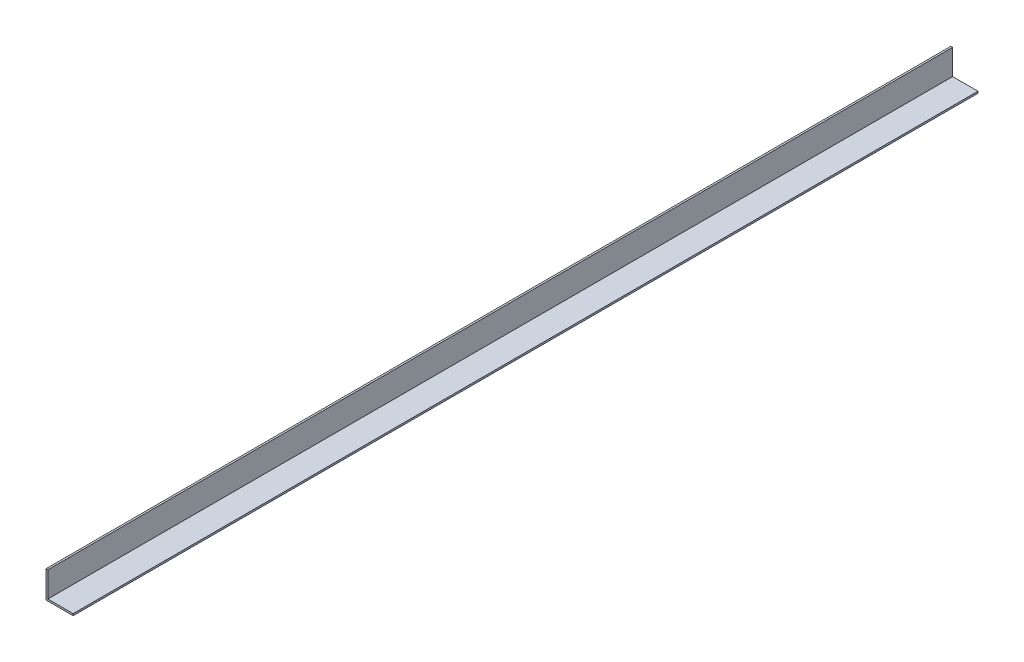
ISO-10303-21;
HEADER;
FILE_DESCRIPTION(('STEP AP214'),'2;1');
FILE_NAME('part.step','',(''),(''),'','','');
FILE_SCHEMA(('AUTOMOTIVE_DESIGN { 1 0 10303 214 1 1 1 1 }'));
ENDSEC;
DATA;
#1=APPLICATION_CONTEXT('core data for automotive mechanical design processes');
#2=APPLICATION_PROTOCOL_DEFINITION('international standard','automotive_design',2000,#1);
#3=PRODUCT_CONTEXT('',#1,'mechanical');
#4=PRODUCT('Part','Part','',(#3));
#5=PRODUCT_RELATED_PRODUCT_CATEGORY('part','',(#4));
#6=PRODUCT_DEFINITION_FORMATION('','',#4);
#7=PRODUCT_DEFINITION_CONTEXT('part definition',#1,'design');
#8=PRODUCT_DEFINITION('design','',#6,#7);
#9=PRODUCT_DEFINITION_SHAPE('','',#8);
#10=(LENGTH_UNIT() NAMED_UNIT(*) SI_UNIT(.MILLI.,.METRE.));
#11=(NAMED_UNIT(*) PLANE_ANGLE_UNIT() SI_UNIT($,.RADIAN.));
#12=(NAMED_UNIT(*) SI_UNIT($,.STERADIAN.) SOLID_ANGLE_UNIT());
#13=UNCERTAINTY_MEASURE_WITH_UNIT(LENGTH_MEASURE(1.E-05),#10,'distance_accuracy_value','');
#14=(GEOMETRIC_REPRESENTATION_CONTEXT(3) GLOBAL_UNCERTAINTY_ASSIGNED_CONTEXT((#13)) GLOBAL_UNIT_ASSIGNED_CONTEXT((#10,
#11,#12)) REPRESENTATION_CONTEXT('',''));
#15=CARTESIAN_POINT('',(0.,0.,0.));
#16=DIRECTION('',(0.,0.,1.));
#17=DIRECTION('',(1.,0.,0.));
#18=AXIS2_PLACEMENT_3D('',#15,#16,#17);
#19=CARTESIAN_POINT('',(-30.,0.,1000.));
#20=DIRECTION('',(1.,0.,0.));
#21=DIRECTION('',(0.,0.,-1.));
#22=AXIS2_PLACEMENT_3D('',#19,#20,#21);
#23=PLANE('',#22);
#24=DIRECTION('',(0.,-1.,0.));
#25=VECTOR('',#24,1.);
#26=CARTESIAN_POINT('',(-30.,0.,0.));
#27=LINE('',#26,#25);
#28=CARTESIAN_POINT('',(-30.,30.,0.));
#29=VERTEX_POINT('',#28);
#30=CARTESIAN_POINT('',(-30.,0.,0.));
#31=VERTEX_POINT('',#30);
#32=EDGE_CURVE('E117',#29,#31,#27,.T.);
#33=ORIENTED_EDGE('',*,*,#32,.T.);
#34=DIRECTION('',(0.,0.,-1.));
#35=VECTOR('',#34,1.);
#36=CARTESIAN_POINT('',(-30.,0.,1000.));
#37=LINE('',#36,#35);
#38=CARTESIAN_POINT('',(-30.,0.,1000.));
#39=VERTEX_POINT('',#38);
#40=EDGE_CURVE('E11',#39,#31,#37,.T.);
#41=ORIENTED_EDGE('',*,*,#40,.F.);
#42=DIRECTION('',(0.,-1.,0.));
#43=VECTOR('',#42,1.);
#44=CARTESIAN_POINT('',(-30.,0.,1000.));
#45=LINE('',#44,#43);
#46=CARTESIAN_POINT('',(-30.,30.,1000.));
#47=VERTEX_POINT('',#46);
#48=EDGE_CURVE('E127',#47,#39,#45,.T.);
#49=ORIENTED_EDGE('',*,*,#48,.F.);
#50=DIRECTION('',(0.,0.,-1.));
#51=VECTOR('',#50,1.);
#52=CARTESIAN_POINT('',(-30.,30.,1000.));
#53=LINE('',#52,#51);
#54=EDGE_CURVE('E113',#47,#29,#53,.T.);
#55=ORIENTED_EDGE('',*,*,#54,.T.);
#56=EDGE_LOOP('',(#33,#41,#49,#55));
#57=FACE_BOUND('',#56,.T.);
#58=ADVANCED_FACE('F33',(#57),#23,.F.);
#59=CARTESIAN_POINT('',(0.,0.,1000.));
#60=DIRECTION('',(0.,1.,0.));
#61=DIRECTION('',(-1.,0.,0.));
#62=AXIS2_PLACEMENT_3D('',#59,#60,#61);
#63=PLANE('',#62);
#64=DIRECTION('',(1.,0.,0.));
#65=VECTOR('',#64,1.);
#66=CARTESIAN_POINT('',(0.,0.,0.));
#67=LINE('',#66,#65);
#68=CARTESIAN_POINT('',(0.,0.,0.));
#69=VERTEX_POINT('',#68);
#70=EDGE_CURVE('E120',#31,#69,#67,.T.);
#71=ORIENTED_EDGE('',*,*,#70,.T.);
#72=DIRECTION('',(0.,0.,-1.));
#73=VECTOR('',#72,1.);
#74=CARTESIAN_POINT('',(0.,0.,1000.));
#75=LINE('',#74,#73);
#76=CARTESIAN_POINT('',(0.,0.,1000.));
#77=VERTEX_POINT('',#76);
#78=EDGE_CURVE('E41',#77,#69,#75,.T.);
#79=ORIENTED_EDGE('',*,*,#78,.F.);
#80=DIRECTION('',(1.,0.,0.));
#81=VECTOR('',#80,1.);
#82=CARTESIAN_POINT('',(0.,0.,1000.));
#83=LINE('',#82,#81);
#84=EDGE_CURVE('E85',#39,#77,#83,.T.);
#85=ORIENTED_EDGE('',*,*,#84,.F.);
#86=ORIENTED_EDGE('',*,*,#40,.T.);
#87=EDGE_LOOP('',(#71,#79,#85,#86));
#88=FACE_BOUND('',#87,.T.);
#89=ADVANCED_FACE('F151',(#88),#63,.F.);
#90=CARTESIAN_POINT('',(0.,2.,1000.));
#91=DIRECTION('',(-1.,0.,0.));
#92=DIRECTION('',(0.,0.,1.));
#93=AXIS2_PLACEMENT_3D('',#90,#91,#92);
#94=PLANE('',#93);
#95=DIRECTION('',(0.,1.,0.));
#96=VECTOR('',#95,1.);
#97=CARTESIAN_POINT('',(0.,2.,0.));
#98=LINE('',#97,#96);
#99=CARTESIAN_POINT('',(0.,2.,0.));
#100=VERTEX_POINT('',#99);
#101=EDGE_CURVE('E122',#69,#100,#98,.T.);
#102=ORIENTED_EDGE('',*,*,#101,.T.);
#103=DIRECTION('',(0.,0.,-1.));
#104=VECTOR('',#103,1.);
#105=CARTESIAN_POINT('',(0.,2.,1000.));
#106=LINE('',#105,#104);
#107=CARTESIAN_POINT('',(0.,2.,1000.));
#108=VERTEX_POINT('',#107);
#109=EDGE_CURVE('E108',#108,#100,#106,.T.);
#110=ORIENTED_EDGE('',*,*,#109,.F.);
#111=DIRECTION('',(0.,1.,0.));
#112=VECTOR('',#111,1.);
#113=CARTESIAN_POINT('',(0.,2.,1000.));
#114=LINE('',#113,#112);
#115=EDGE_CURVE('E98',#77,#108,#114,.T.);
#116=ORIENTED_EDGE('',*,*,#115,.F.);
#117=ORIENTED_EDGE('',*,*,#78,.T.);
#118=EDGE_LOOP('',(#102,#110,#116,#117));
#119=FACE_BOUND('',#118,.T.);
#120=ADVANCED_FACE('F133',(#119),#94,.F.);
#121=CARTESIAN_POINT('',(0.,2.,1000.));
#122=DIRECTION('',(0.,-1.,0.));
#123=DIRECTION('',(1.,0.,0.));
#124=AXIS2_PLACEMENT_3D('',#121,#122,#123);
#125=PLANE('',#124);
#126=DIRECTION('',(-1.,0.,0.));
#127=VECTOR('',#126,1.);
#128=CARTESIAN_POINT('',(0.,2.,0.));
#129=LINE('',#128,#127);
#130=CARTESIAN_POINT('',(-28.,2.,0.));
#131=VERTEX_POINT('',#130);
#132=EDGE_CURVE('E107',#100,#131,#129,.T.);
#133=ORIENTED_EDGE('',*,*,#132,.T.);
#134=DIRECTION('',(0.,0.,-1.));
#135=VECTOR('',#134,1.);
#136=CARTESIAN_POINT('',(-28.,2.,1000.));
#137=LINE('',#136,#135);
#138=CARTESIAN_POINT('',(-28.,2.,1000.));
#139=VERTEX_POINT('',#138);
#140=EDGE_CURVE('E104',#139,#131,#137,.T.);
#141=ORIENTED_EDGE('',*,*,#140,.F.);
#142=DIRECTION('',(-1.,0.,0.));
#143=VECTOR('',#142,1.);
#144=CARTESIAN_POINT('',(0.,2.,1000.));
#145=LINE('',#144,#143);
#146=EDGE_CURVE('E92',#108,#139,#145,.T.);
#147=ORIENTED_EDGE('',*,*,#146,.F.);
#148=ORIENTED_EDGE('',*,*,#109,.T.);
#149=EDGE_LOOP('',(#133,#141,#147,#148));
#150=FACE_BOUND('',#149,.T.);
#151=ADVANCED_FACE('F105',(#150),#125,.F.);
#152=CARTESIAN_POINT('',(-28.,28.,1000.));
#153=DIRECTION('',(-1.,0.,0.));
#154=DIRECTION('',(0.,0.,1.));
#155=AXIS2_PLACEMENT_3D('',#152,#153,#154);
#156=PLANE('',#155);
#157=DIRECTION('',(0.,1.,0.));
#158=VECTOR('',#157,1.);
#159=CARTESIAN_POINT('',(-28.,28.,0.));
#160=LINE('',#159,#158);
#161=CARTESIAN_POINT('',(-28.,30.,0.));
#162=VERTEX_POINT('',#161);
#163=EDGE_CURVE('E71',#131,#162,#160,.T.);
#164=ORIENTED_EDGE('',*,*,#163,.T.);
#165=DIRECTION('',(0.,0.,-1.));
#166=VECTOR('',#165,1.);
#167=CARTESIAN_POINT('',(-28.,30.,1000.));
#168=LINE('',#167,#166);
#169=CARTESIAN_POINT('',(-28.,30.,1000.));
#170=VERTEX_POINT('',#169);
#171=EDGE_CURVE('E109',#170,#162,#168,.T.);
#172=ORIENTED_EDGE('',*,*,#171,.F.);
#173=DIRECTION('',(0.,1.,0.));
#174=VECTOR('',#173,1.);
#175=CARTESIAN_POINT('',(-28.,2.,1000.));
#176=LINE('',#175,#174);
#177=EDGE_CURVE('E96',#139,#170,#176,.T.);
#178=ORIENTED_EDGE('',*,*,#177,.F.);
#179=ORIENTED_EDGE('',*,*,#140,.T.);
#180=EDGE_LOOP('',(#164,#172,#178,#179));
#181=FACE_BOUND('',#180,.T.);
#182=ADVANCED_FACE('F111',(#181),#156,.F.);
#183=CARTESIAN_POINT('',(-28.,30.,1000.));
#184=DIRECTION('',(0.,-1.,0.));
#185=DIRECTION('',(0.,0.,-1.));
#186=AXIS2_PLACEMENT_3D('',#183,#184,#185);
#187=PLANE('',#186);
#188=DIRECTION('',(-1.,0.,0.));
#189=VECTOR('',#188,1.);
#190=CARTESIAN_POINT('',(-28.,30.,0.));
#191=LINE('',#190,#189);
#192=EDGE_CURVE('E77',#162,#29,#191,.T.);
#193=ORIENTED_EDGE('',*,*,#192,.T.);
#194=ORIENTED_EDGE('',*,*,#54,.F.);
#195=DIRECTION('',(-1.,0.,0.));
#196=VECTOR('',#195,1.);
#197=CARTESIAN_POINT('',(-28.,30.,1000.));
#198=LINE('',#197,#196);
#199=EDGE_CURVE('E49',#170,#47,#198,.T.);
#200=ORIENTED_EDGE('',*,*,#199,.F.);
#201=ORIENTED_EDGE('',*,*,#171,.T.);
#202=EDGE_LOOP('',(#193,#194,#200,#201));
#203=FACE_BOUND('',#202,.T.);
#204=ADVANCED_FACE('F140',(#203),#187,.F.);
#205=CARTESIAN_POINT('',(0.,0.,1000.));
#206=DIRECTION('',(0.,0.,1.));
#207=DIRECTION('',(1.,0.,0.));
#208=AXIS2_PLACEMENT_3D('',#205,#206,#207);
#209=PLANE('',#208);
#210=ORIENTED_EDGE('',*,*,#48,.T.);
#211=ORIENTED_EDGE('',*,*,#84,.T.);
#212=ORIENTED_EDGE('',*,*,#115,.T.);
#213=ORIENTED_EDGE('',*,*,#146,.T.);
#214=ORIENTED_EDGE('',*,*,#177,.T.);
#215=ORIENTED_EDGE('',*,*,#199,.T.);
#216=EDGE_LOOP('',(#210,#211,#212,#213,#214,#215));
#217=FACE_BOUND('',#216,.T.);
#218=ADVANCED_FACE('F94',(#217),#209,.T.);
#219=CARTESIAN_POINT('',(0.,0.,0.));
#220=DIRECTION('',(0.,0.,1.));
#221=DIRECTION('',(1.,0.,0.));
#222=AXIS2_PLACEMENT_3D('',#219,#220,#221);
#223=PLANE('',#222);
#224=ORIENTED_EDGE('',*,*,#32,.F.);
#225=ORIENTED_EDGE('',*,*,#192,.F.);
#226=ORIENTED_EDGE('',*,*,#163,.F.);
#227=ORIENTED_EDGE('',*,*,#132,.F.);
#228=ORIENTED_EDGE('',*,*,#101,.F.);
#229=ORIENTED_EDGE('',*,*,#70,.F.);
#230=EDGE_LOOP('',(#224,#225,#226,#227,#228,#229));
#231=FACE_BOUND('',#230,.T.);
#232=ADVANCED_FACE('F136',(#231),#223,.F.);
#233=CLOSED_SHELL('',(#58,#89,#120,#151,#182,#204,#218,#232));
#234=MANIFOLD_SOLID_BREP('B2',#233);
#235=ADVANCED_BREP_SHAPE_REPRESENTATION('',(#18,#234),#14);
#236=SHAPE_DEFINITION_REPRESENTATION(#9,#235);
ENDSEC;
END-ISO-10303-21;
